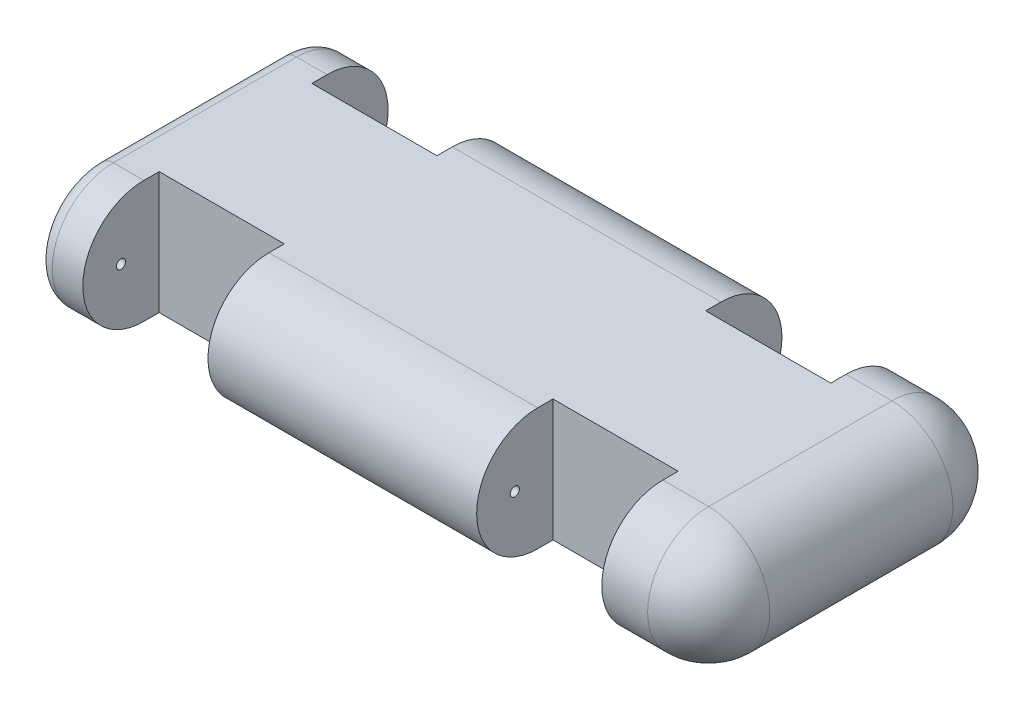
ISO-10303-21;
HEADER;
FILE_DESCRIPTION(('STEP AP214'),'2;1');
FILE_NAME('part.step','',(''),(''),'','','');
FILE_SCHEMA(('AUTOMOTIVE_DESIGN { 1 0 10303 214 1 1 1 1 }'));
ENDSEC;
DATA;
#1=APPLICATION_CONTEXT('core data for automotive mechanical design processes');
#2=APPLICATION_PROTOCOL_DEFINITION('international standard','automotive_design',2000,#1);
#3=PRODUCT_CONTEXT('',#1,'mechanical');
#4=PRODUCT('Part','Part','',(#3));
#5=PRODUCT_RELATED_PRODUCT_CATEGORY('part','',(#4));
#6=PRODUCT_DEFINITION_FORMATION('','',#4);
#7=PRODUCT_DEFINITION_CONTEXT('part definition',#1,'design');
#8=PRODUCT_DEFINITION('design','',#6,#7);
#9=PRODUCT_DEFINITION_SHAPE('','',#8);
#10=(LENGTH_UNIT() NAMED_UNIT(*) SI_UNIT(.MILLI.,.METRE.));
#11=(NAMED_UNIT(*) PLANE_ANGLE_UNIT() SI_UNIT($,.RADIAN.));
#12=(NAMED_UNIT(*) SI_UNIT($,.STERADIAN.) SOLID_ANGLE_UNIT());
#13=UNCERTAINTY_MEASURE_WITH_UNIT(LENGTH_MEASURE(1.E-05),#10,'distance_accuracy_value','');
#14=(GEOMETRIC_REPRESENTATION_CONTEXT(3) GLOBAL_UNCERTAINTY_ASSIGNED_CONTEXT((#13)) GLOBAL_UNIT_ASSIGNED_CONTEXT((#10,
#11,#12)) REPRESENTATION_CONTEXT('',''));
#15=CARTESIAN_POINT('',(0.,0.,0.));
#16=DIRECTION('',(0.,0.,1.));
#17=DIRECTION('',(1.,0.,0.));
#18=AXIS2_PLACEMENT_3D('',#15,#16,#17);
#19=CARTESIAN_POINT('',(-200.,40.,-100.));
#20=DIRECTION('',(1.,0.,0.));
#21=DIRECTION('',(0.,0.,-1.));
#22=AXIS2_PLACEMENT_3D('',#19,#20,#21);
#23=PLANE('',#22);
#24=DIRECTION('',(0.,0.,1.));
#25=VECTOR('',#24,1.);
#26=CARTESIAN_POINT('',(-200.,30.,-60.));
#27=LINE('',#26,#25);
#28=CARTESIAN_POINT('',(-200.,30.,60.));
#29=VERTEX_POINT('',#28);
#30=CARTESIAN_POINT('',(-200.,30.,-60.));
#31=VERTEX_POINT('',#30);
#32=EDGE_CURVE('E279',#29,#31,#27,.F.);
#33=ORIENTED_EDGE('',*,*,#32,.T.);
#34=CARTESIAN_POINT('',(-200.,0.,-60.));
#35=DIRECTION('',(1.,0.,0.));
#36=DIRECTION('',(0.,0.,-1.));
#37=AXIS2_PLACEMENT_3D('',#34,#35,#36);
#38=CIRCLE('',#37,30.);
#39=CARTESIAN_POINT('',(-200.,-30.,-60.));
#40=VERTEX_POINT('',#39);
#41=EDGE_CURVE('E285',#31,#40,#38,.F.);
#42=ORIENTED_EDGE('',*,*,#41,.T.);
#43=DIRECTION('',(0.,0.,1.));
#44=VECTOR('',#43,1.);
#45=CARTESIAN_POINT('',(-200.,-30.,-100.));
#46=LINE('',#45,#44);
#47=CARTESIAN_POINT('',(-200.,-30.,60.));
#48=VERTEX_POINT('',#47);
#49=EDGE_CURVE('E283',#40,#48,#46,.T.);
#50=ORIENTED_EDGE('',*,*,#49,.T.);
#51=CARTESIAN_POINT('',(-200.,0.,60.));
#52=DIRECTION('',(1.,0.,0.));
#53=DIRECTION('',(0.,0.,-1.));
#54=AXIS2_PLACEMENT_3D('',#51,#52,#53);
#55=CIRCLE('',#54,30.);
#56=EDGE_CURVE('E281',#48,#29,#55,.F.);
#57=ORIENTED_EDGE('',*,*,#56,.T.);
#58=EDGE_LOOP('',(#33,#42,#50,#57));
#59=FACE_BOUND('',#58,.T.);
#60=CARTESIAN_POINT('',(-200.,0.,74.9999999999999));
#61=DIRECTION('',(-1.,0.,0.));
#62=DIRECTION('',(0.,0.,1.));
#63=AXIS2_PLACEMENT_3D('',#60,#61,#62);
#64=CIRCLE('',#63,3.00000000000001);
#65=CARTESIAN_POINT('',(-200.,0.,77.9999999999999));
#66=VERTEX_POINT('',#65);
#67=EDGE_CURVE('E339',#66,#66,#64,.T.);
#68=ORIENTED_EDGE('',*,*,#67,.F.);
#69=EDGE_LOOP('',(#68));
#70=FACE_BOUND('',#69,.T.);
#71=CARTESIAN_POINT('',(-200.,0.,-74.9999999999999));
#72=DIRECTION('',(-1.,0.,0.));
#73=DIRECTION('',(0.,0.,1.));
#74=AXIS2_PLACEMENT_3D('',#71,#72,#73);
#75=CIRCLE('',#74,3.00000000000001);
#76=CARTESIAN_POINT('',(-200.,0.,-71.9999999999999));
#77=VERTEX_POINT('',#76);
#78=EDGE_CURVE('E357',#77,#77,#75,.T.);
#79=ORIENTED_EDGE('',*,*,#78,.F.);
#80=EDGE_LOOP('',(#79));
#81=FACE_BOUND('',#80,.T.);
#82=ADVANCED_FACE('F37',(#59,#70,#81),#23,.F.);
#83=CARTESIAN_POINT('',(-170.,40.,100.));
#84=DIRECTION('',(-1.,0.,0.));
#85=DIRECTION('',(0.,0.,1.));
#86=AXIS2_PLACEMENT_3D('',#83,#84,#85);
#87=PLANE('',#86);
#88=CARTESIAN_POINT('',(-170.,0.,74.9999999999998));
#89=DIRECTION('',(-1.,0.,0.));
#90=DIRECTION('',(0.,0.,1.));
#91=AXIS2_PLACEMENT_3D('',#88,#89,#90);
#92=CIRCLE('',#91,3.00000000000001);
#93=CARTESIAN_POINT('',(-170.,0.,77.9999999999998));
#94=VERTEX_POINT('',#93);
#95=EDGE_CURVE('E354',#94,#94,#92,.T.);
#96=ORIENTED_EDGE('',*,*,#95,.T.);
#97=EDGE_LOOP('',(#96));
#98=FACE_BOUND('',#97,.T.);
#99=DIRECTION('',(0.,0.,-1.));
#100=VECTOR('',#99,1.);
#101=CARTESIAN_POINT('',(-170.,40.,100.));
#102=LINE('',#101,#100);
#103=CARTESIAN_POINT('',(-170.,40.,60.));
#104=VERTEX_POINT('',#103);
#105=CARTESIAN_POINT('',(-170.,40.,50.));
#106=VERTEX_POINT('',#105);
#107=EDGE_CURVE('E239',#104,#106,#102,.T.);
#108=ORIENTED_EDGE('',*,*,#107,.F.);
#109=CARTESIAN_POINT('',(-170.,0.,60.));
#110=DIRECTION('',(-1.,0.,0.));
#111=DIRECTION('',(0.,0.,1.));
#112=AXIS2_PLACEMENT_3D('',#109,#110,#111);
#113=CIRCLE('',#112,40.);
#114=CARTESIAN_POINT('',(-170.,-40.,60.));
#115=VERTEX_POINT('',#114);
#116=EDGE_CURVE('E214',#104,#115,#113,.F.);
#117=ORIENTED_EDGE('',*,*,#116,.T.);
#118=DIRECTION('',(0.,0.,-1.));
#119=VECTOR('',#118,1.);
#120=CARTESIAN_POINT('',(-170.,-40.,100.));
#121=LINE('',#120,#119);
#122=CARTESIAN_POINT('',(-170.,-40.,50.));
#123=VERTEX_POINT('',#122);
#124=EDGE_CURVE('E370',#115,#123,#121,.T.);
#125=ORIENTED_EDGE('',*,*,#124,.T.);
#126=DIRECTION('',(0.,-1.,0.));
#127=VECTOR('',#126,1.);
#128=CARTESIAN_POINT('',(-170.,40.,50.));
#129=LINE('',#128,#127);
#130=EDGE_CURVE('E262',#106,#123,#129,.T.);
#131=ORIENTED_EDGE('',*,*,#130,.F.);
#132=EDGE_LOOP('',(#108,#117,#125,#131));
#133=FACE_BOUND('',#132,.T.);
#134=ADVANCED_FACE('F438',(#98,#133),#87,.F.);
#135=CARTESIAN_POINT('',(-88.,40.,100.));
#136=DIRECTION('',(1.,0.,0.));
#137=DIRECTION('',(0.,0.,-1.));
#138=AXIS2_PLACEMENT_3D('',#135,#136,#137);
#139=PLANE('',#138);
#140=CARTESIAN_POINT('',(-88.0000000000001,0.,74.9999999999997));
#141=DIRECTION('',(1.,0.,0.));
#142=DIRECTION('',(0.,0.,-1.));
#143=AXIS2_PLACEMENT_3D('',#140,#141,#142);
#144=CIRCLE('',#143,3.00000000000001);
#145=CARTESIAN_POINT('',(-88.0000000000001,0.,71.9999999999997));
#146=VERTEX_POINT('',#145);
#147=EDGE_CURVE('E351',#146,#146,#144,.T.);
#148=ORIENTED_EDGE('',*,*,#147,.T.);
#149=EDGE_LOOP('',(#148));
#150=FACE_BOUND('',#149,.T.);
#151=DIRECTION('',(0.,0.,1.));
#152=VECTOR('',#151,1.);
#153=CARTESIAN_POINT('',(-88.,-40.,100.));
#154=LINE('',#153,#152);
#155=CARTESIAN_POINT('',(-88.,-40.,50.));
#156=VERTEX_POINT('',#155);
#157=CARTESIAN_POINT('',(-88.,-40.,60.));
#158=VERTEX_POINT('',#157);
#159=EDGE_CURVE('E401',#156,#158,#154,.T.);
#160=ORIENTED_EDGE('',*,*,#159,.T.);
#161=CARTESIAN_POINT('',(-88.0000000000001,0.,60.));
#162=DIRECTION('',(1.,0.,0.));
#163=DIRECTION('',(0.,0.,-1.));
#164=AXIS2_PLACEMENT_3D('',#161,#162,#163);
#165=CIRCLE('',#164,40.);
#166=CARTESIAN_POINT('',(-88.0000000000001,40.,60.));
#167=VERTEX_POINT('',#166);
#168=EDGE_CURVE('E432',#158,#167,#165,.F.);
#169=ORIENTED_EDGE('',*,*,#168,.T.);
#170=DIRECTION('',(0.,0.,1.));
#171=VECTOR('',#170,1.);
#172=CARTESIAN_POINT('',(-88.,40.,100.));
#173=LINE('',#172,#171);
#174=CARTESIAN_POINT('',(-88.,40.,50.));
#175=VERTEX_POINT('',#174);
#176=EDGE_CURVE('E374',#175,#167,#173,.T.);
#177=ORIENTED_EDGE('',*,*,#176,.F.);
#178=DIRECTION('',(0.,-1.,0.));
#179=VECTOR('',#178,1.);
#180=CARTESIAN_POINT('',(-88.,40.,50.));
#181=LINE('',#180,#179);
#182=EDGE_CURVE('E259',#175,#156,#181,.T.);
#183=ORIENTED_EDGE('',*,*,#182,.T.);
#184=EDGE_LOOP('',(#160,#169,#177,#183));
#185=FACE_BOUND('',#184,.T.);
#186=ADVANCED_FACE('F449',(#150,#185),#139,.F.);
#187=CARTESIAN_POINT('',(88.,40.,100.));
#188=DIRECTION('',(-1.,0.,0.));
#189=DIRECTION('',(0.,0.,1.));
#190=AXIS2_PLACEMENT_3D('',#187,#188,#189);
#191=PLANE('',#190);
#192=CARTESIAN_POINT('',(88.,0.,74.9999999999995));
#193=DIRECTION('',(-1.,0.,0.));
#194=DIRECTION('',(0.,0.,1.));
#195=AXIS2_PLACEMENT_3D('',#192,#193,#194);
#196=CIRCLE('',#195,3.00000000000001);
#197=CARTESIAN_POINT('',(88.,0.,77.9999999999995));
#198=VERTEX_POINT('',#197);
#199=EDGE_CURVE('E348',#198,#198,#196,.T.);
#200=ORIENTED_EDGE('',*,*,#199,.T.);
#201=EDGE_LOOP('',(#200));
#202=FACE_BOUND('',#201,.T.);
#203=DIRECTION('',(0.,0.,-1.));
#204=VECTOR('',#203,1.);
#205=CARTESIAN_POINT('',(88.,40.,100.));
#206=LINE('',#205,#204);
#207=CARTESIAN_POINT('',(88.,40.,60.));
#208=VERTEX_POINT('',#207);
#209=CARTESIAN_POINT('',(88.,40.,50.));
#210=VERTEX_POINT('',#209);
#211=EDGE_CURVE('E377',#208,#210,#206,.T.);
#212=ORIENTED_EDGE('',*,*,#211,.F.);
#213=CARTESIAN_POINT('',(88.,0.,60.));
#214=DIRECTION('',(-1.,0.,0.));
#215=DIRECTION('',(0.,0.,1.));
#216=AXIS2_PLACEMENT_3D('',#213,#214,#215);
#217=CIRCLE('',#216,40.);
#218=CARTESIAN_POINT('',(88.,-40.,60.));
#219=VERTEX_POINT('',#218);
#220=EDGE_CURVE('E429',#208,#219,#217,.F.);
#221=ORIENTED_EDGE('',*,*,#220,.T.);
#222=DIRECTION('',(0.,0.,-1.));
#223=VECTOR('',#222,1.);
#224=CARTESIAN_POINT('',(88.,-40.,100.));
#225=LINE('',#224,#223);
#226=CARTESIAN_POINT('',(88.,-40.,50.));
#227=VERTEX_POINT('',#226);
#228=EDGE_CURVE('E404',#219,#227,#225,.T.);
#229=ORIENTED_EDGE('',*,*,#228,.T.);
#230=DIRECTION('',(0.,-1.,0.));
#231=VECTOR('',#230,1.);
#232=CARTESIAN_POINT('',(88.,40.,50.));
#233=LINE('',#232,#231);
#234=EDGE_CURVE('E256',#210,#227,#233,.T.);
#235=ORIENTED_EDGE('',*,*,#234,.F.);
#236=EDGE_LOOP('',(#212,#221,#229,#235));
#237=FACE_BOUND('',#236,.T.);
#238=ADVANCED_FACE('F608',(#202,#237),#191,.F.);
#239=CARTESIAN_POINT('',(170.,40.,100.));
#240=DIRECTION('',(1.,0.,0.));
#241=DIRECTION('',(0.,0.,-1.));
#242=AXIS2_PLACEMENT_3D('',#239,#240,#241);
#243=PLANE('',#242);
#244=CARTESIAN_POINT('',(170.,0.,74.9999999999993));
#245=DIRECTION('',(1.,0.,0.));
#246=DIRECTION('',(0.,0.,-1.));
#247=AXIS2_PLACEMENT_3D('',#244,#245,#246);
#248=CIRCLE('',#247,3.00000000000001);
#249=CARTESIAN_POINT('',(170.,0.,71.9999999999993));
#250=VERTEX_POINT('',#249);
#251=EDGE_CURVE('E345',#250,#250,#248,.T.);
#252=ORIENTED_EDGE('',*,*,#251,.T.);
#253=EDGE_LOOP('',(#252));
#254=FACE_BOUND('',#253,.T.);
#255=DIRECTION('',(0.,0.,1.));
#256=VECTOR('',#255,1.);
#257=CARTESIAN_POINT('',(170.,-40.,100.));
#258=LINE('',#257,#256);
#259=CARTESIAN_POINT('',(170.,-40.,50.));
#260=VERTEX_POINT('',#259);
#261=CARTESIAN_POINT('',(170.,-40.,60.));
#262=VERTEX_POINT('',#261);
#263=EDGE_CURVE('E219',#260,#262,#258,.T.);
#264=ORIENTED_EDGE('',*,*,#263,.T.);
#265=CARTESIAN_POINT('',(170.,0.,60.));
#266=DIRECTION('',(1.,0.,0.));
#267=DIRECTION('',(0.,0.,-1.));
#268=AXIS2_PLACEMENT_3D('',#265,#266,#267);
#269=CIRCLE('',#268,40.);
#270=CARTESIAN_POINT('',(170.,40.,60.));
#271=VERTEX_POINT('',#270);
#272=EDGE_CURVE('E427',#262,#271,#269,.F.);
#273=ORIENTED_EDGE('',*,*,#272,.T.);
#274=DIRECTION('',(0.,0.,1.));
#275=VECTOR('',#274,1.);
#276=CARTESIAN_POINT('',(170.,40.,100.));
#277=LINE('',#276,#275);
#278=CARTESIAN_POINT('',(170.,40.,50.));
#279=VERTEX_POINT('',#278);
#280=EDGE_CURVE('E381',#279,#271,#277,.T.);
#281=ORIENTED_EDGE('',*,*,#280,.F.);
#282=DIRECTION('',(0.,-1.,0.));
#283=VECTOR('',#282,1.);
#284=CARTESIAN_POINT('',(170.,40.,50.));
#285=LINE('',#284,#283);
#286=EDGE_CURVE('E253',#279,#260,#285,.T.);
#287=ORIENTED_EDGE('',*,*,#286,.T.);
#288=EDGE_LOOP('',(#264,#273,#281,#287));
#289=FACE_BOUND('',#288,.T.);
#290=ADVANCED_FACE('F415',(#254,#289),#243,.F.);
#291=CARTESIAN_POINT('',(170.,40.,-100.));
#292=DIRECTION('',(1.,0.,0.));
#293=DIRECTION('',(0.,0.,-1.));
#294=AXIS2_PLACEMENT_3D('',#291,#292,#293);
#295=PLANE('',#294);
#296=CARTESIAN_POINT('',(170.,0.,-74.9999999999994));
#297=DIRECTION('',(1.,0.,0.));
#298=DIRECTION('',(0.,0.,-1.));
#299=AXIS2_PLACEMENT_3D('',#296,#297,#298);
#300=CIRCLE('',#299,3.00000000000001);
#301=CARTESIAN_POINT('',(170.,0.,-77.9999999999994));
#302=VERTEX_POINT('',#301);
#303=EDGE_CURVE('E367',#302,#302,#300,.T.);
#304=ORIENTED_EDGE('',*,*,#303,.T.);
#305=EDGE_LOOP('',(#304));
#306=FACE_BOUND('',#305,.T.);
#307=CARTESIAN_POINT('',(170.,0.,-60.));
#308=DIRECTION('',(1.,0.,0.));
#309=DIRECTION('',(0.,0.,-1.));
#310=AXIS2_PLACEMENT_3D('',#307,#308,#309);
#311=CIRCLE('',#310,40.);
#312=CARTESIAN_POINT('',(170.,40.,-60.));
#313=VERTEX_POINT('',#312);
#314=CARTESIAN_POINT('',(170.,-40.,-60.));
#315=VERTEX_POINT('',#314);
#316=EDGE_CURVE('E337',#313,#315,#311,.F.);
#317=ORIENTED_EDGE('',*,*,#316,.T.);
#318=DIRECTION('',(0.,0.,1.));
#319=VECTOR('',#318,1.);
#320=CARTESIAN_POINT('',(170.,-40.,-100.));
#321=LINE('',#320,#319);
#322=CARTESIAN_POINT('',(170.,-40.,-50.));
#323=VERTEX_POINT('',#322);
#324=EDGE_CURVE('E206',#315,#323,#321,.T.);
#325=ORIENTED_EDGE('',*,*,#324,.T.);
#326=DIRECTION('',(0.,-1.,0.));
#327=VECTOR('',#326,1.);
#328=CARTESIAN_POINT('',(170.,40.,-50.));
#329=LINE('',#328,#327);
#330=CARTESIAN_POINT('',(170.,40.,-50.));
#331=VERTEX_POINT('',#330);
#332=EDGE_CURVE('E250',#331,#323,#329,.T.);
#333=ORIENTED_EDGE('',*,*,#332,.F.);
#334=DIRECTION('',(0.,0.,1.));
#335=VECTOR('',#334,1.);
#336=CARTESIAN_POINT('',(170.,40.,-100.));
#337=LINE('',#336,#335);
#338=EDGE_CURVE('E386',#313,#331,#337,.T.);
#339=ORIENTED_EDGE('',*,*,#338,.F.);
#340=EDGE_LOOP('',(#317,#325,#333,#339));
#341=FACE_BOUND('',#340,.T.);
#342=ADVANCED_FACE('F607',(#306,#341),#295,.F.);
#343=CARTESIAN_POINT('',(88.,40.,-100.));
#344=DIRECTION('',(-1.,0.,0.));
#345=DIRECTION('',(0.,0.,1.));
#346=AXIS2_PLACEMENT_3D('',#343,#344,#345);
#347=PLANE('',#346);
#348=CARTESIAN_POINT('',(88.,0.,-74.9999999999995));
#349=DIRECTION('',(-1.,0.,0.));
#350=DIRECTION('',(0.,0.,1.));
#351=AXIS2_PLACEMENT_3D('',#348,#349,#350);
#352=CIRCLE('',#351,3.00000000000001);
#353=CARTESIAN_POINT('',(88.,0.,-71.9999999999995));
#354=VERTEX_POINT('',#353);
#355=EDGE_CURVE('E364',#354,#354,#352,.T.);
#356=ORIENTED_EDGE('',*,*,#355,.T.);
#357=EDGE_LOOP('',(#356));
#358=FACE_BOUND('',#357,.T.);
#359=DIRECTION('',(0.,0.,-1.));
#360=VECTOR('',#359,1.);
#361=CARTESIAN_POINT('',(88.,-40.,-100.));
#362=LINE('',#361,#360);
#363=CARTESIAN_POINT('',(88.,-40.,-50.));
#364=VERTEX_POINT('',#363);
#365=CARTESIAN_POINT('',(88.,-40.,-60.));
#366=VERTEX_POINT('',#365);
#367=EDGE_CURVE('E229',#364,#366,#362,.T.);
#368=ORIENTED_EDGE('',*,*,#367,.T.);
#369=CARTESIAN_POINT('',(88.,0.,-60.));
#370=DIRECTION('',(-1.,0.,0.));
#371=DIRECTION('',(0.,0.,1.));
#372=AXIS2_PLACEMENT_3D('',#369,#370,#371);
#373=CIRCLE('',#372,40.);
#374=CARTESIAN_POINT('',(88.,40.,-60.));
#375=VERTEX_POINT('',#374);
#376=EDGE_CURVE('E333',#366,#375,#373,.F.);
#377=ORIENTED_EDGE('',*,*,#376,.T.);
#378=DIRECTION('',(0.,0.,-1.));
#379=VECTOR('',#378,1.);
#380=CARTESIAN_POINT('',(88.,40.,-100.));
#381=LINE('',#380,#379);
#382=CARTESIAN_POINT('',(88.,40.,-50.));
#383=VERTEX_POINT('',#382);
#384=EDGE_CURVE('E390',#383,#375,#381,.T.);
#385=ORIENTED_EDGE('',*,*,#384,.F.);
#386=DIRECTION('',(0.,-1.,0.));
#387=VECTOR('',#386,1.);
#388=CARTESIAN_POINT('',(88.,40.,-50.));
#389=LINE('',#388,#387);
#390=EDGE_CURVE('E247',#383,#364,#389,.T.);
#391=ORIENTED_EDGE('',*,*,#390,.T.);
#392=EDGE_LOOP('',(#368,#377,#385,#391));
#393=FACE_BOUND('',#392,.T.);
#394=ADVANCED_FACE('F663',(#358,#393),#347,.F.);
#395=CARTESIAN_POINT('',(-88.,40.,-100.));
#396=DIRECTION('',(1.,0.,0.));
#397=DIRECTION('',(0.,0.,-1.));
#398=AXIS2_PLACEMENT_3D('',#395,#396,#397);
#399=PLANE('',#398);
#400=CARTESIAN_POINT('',(-88.0000000000001,0.,-74.9999999999998));
#401=DIRECTION('',(1.,0.,0.));
#402=DIRECTION('',(0.,0.,-1.));
#403=AXIS2_PLACEMENT_3D('',#400,#401,#402);
#404=CIRCLE('',#403,3.00000000000001);
#405=CARTESIAN_POINT('',(-88.0000000000001,0.,-77.9999999999998));
#406=VERTEX_POINT('',#405);
#407=EDGE_CURVE('E269',#406,#406,#404,.T.);
#408=ORIENTED_EDGE('',*,*,#407,.T.);
#409=EDGE_LOOP('',(#408));
#410=FACE_BOUND('',#409,.T.);
#411=DIRECTION('',(0.,0.,1.));
#412=VECTOR('',#411,1.);
#413=CARTESIAN_POINT('',(-88.,40.,-100.));
#414=LINE('',#413,#412);
#415=CARTESIAN_POINT('',(-88.0000000000001,40.,-60.));
#416=VERTEX_POINT('',#415);
#417=CARTESIAN_POINT('',(-88.,40.,-50.));
#418=VERTEX_POINT('',#417);
#419=EDGE_CURVE('E393',#416,#418,#414,.T.);
#420=ORIENTED_EDGE('',*,*,#419,.F.);
#421=CARTESIAN_POINT('',(-88.0000000000001,0.,-60.));
#422=DIRECTION('',(1.,0.,0.));
#423=DIRECTION('',(0.,0.,-1.));
#424=AXIS2_PLACEMENT_3D('',#421,#422,#423);
#425=CIRCLE('',#424,40.);
#426=CARTESIAN_POINT('',(-88.0000000000001,-40.,-60.));
#427=VERTEX_POINT('',#426);
#428=EDGE_CURVE('E329',#416,#427,#425,.F.);
#429=ORIENTED_EDGE('',*,*,#428,.T.);
#430=DIRECTION('',(0.,0.,1.));
#431=VECTOR('',#430,1.);
#432=CARTESIAN_POINT('',(-88.,-40.,-100.));
#433=LINE('',#432,#431);
#434=CARTESIAN_POINT('',(-88.,-40.,-50.));
#435=VERTEX_POINT('',#434);
#436=EDGE_CURVE('E232',#427,#435,#433,.T.);
#437=ORIENTED_EDGE('',*,*,#436,.T.);
#438=DIRECTION('',(0.,-1.,0.));
#439=VECTOR('',#438,1.);
#440=CARTESIAN_POINT('',(-88.,40.,-50.));
#441=LINE('',#440,#439);
#442=EDGE_CURVE('E243',#418,#435,#441,.T.);
#443=ORIENTED_EDGE('',*,*,#442,.F.);
#444=EDGE_LOOP('',(#420,#429,#437,#443));
#445=FACE_BOUND('',#444,.T.);
#446=ADVANCED_FACE('F651',(#410,#445),#399,.F.);
#447=CARTESIAN_POINT('',(-170.,40.,-100.));
#448=DIRECTION('',(-1.,0.,0.));
#449=DIRECTION('',(0.,0.,1.));
#450=AXIS2_PLACEMENT_3D('',#447,#448,#449);
#451=PLANE('',#450);
#452=CARTESIAN_POINT('',(-170.,0.,-74.9999999999999));
#453=DIRECTION('',(-1.,0.,0.));
#454=DIRECTION('',(0.,0.,1.));
#455=AXIS2_PLACEMENT_3D('',#452,#453,#454);
#456=CIRCLE('',#455,3.00000000000001);
#457=CARTESIAN_POINT('',(-170.,0.,-71.9999999999999));
#458=VERTEX_POINT('',#457);
#459=EDGE_CURVE('E266',#458,#458,#456,.T.);
#460=ORIENTED_EDGE('',*,*,#459,.T.);
#461=EDGE_LOOP('',(#460));
#462=FACE_BOUND('',#461,.T.);
#463=DIRECTION('',(0.,0.,-1.));
#464=VECTOR('',#463,1.);
#465=CARTESIAN_POINT('',(-170.,-40.,-100.));
#466=LINE('',#465,#464);
#467=CARTESIAN_POINT('',(-170.,-40.,-50.));
#468=VERTEX_POINT('',#467);
#469=CARTESIAN_POINT('',(-170.,-40.,-60.));
#470=VERTEX_POINT('',#469);
#471=EDGE_CURVE('E236',#468,#470,#466,.T.);
#472=ORIENTED_EDGE('',*,*,#471,.T.);
#473=CARTESIAN_POINT('',(-170.,0.,-60.));
#474=DIRECTION('',(-1.,0.,0.));
#475=DIRECTION('',(0.,0.,1.));
#476=AXIS2_PLACEMENT_3D('',#473,#474,#475);
#477=CIRCLE('',#476,40.);
#478=CARTESIAN_POINT('',(-170.,40.,-60.));
#479=VERTEX_POINT('',#478);
#480=EDGE_CURVE('E327',#470,#479,#477,.F.);
#481=ORIENTED_EDGE('',*,*,#480,.T.);
#482=DIRECTION('',(0.,0.,-1.));
#483=VECTOR('',#482,1.);
#484=CARTESIAN_POINT('',(-170.,40.,-100.));
#485=LINE('',#484,#483);
#486=CARTESIAN_POINT('',(-170.,40.,-50.));
#487=VERTEX_POINT('',#486);
#488=EDGE_CURVE('E244',#487,#479,#485,.T.);
#489=ORIENTED_EDGE('',*,*,#488,.F.);
#490=DIRECTION('',(0.,-1.,0.));
#491=VECTOR('',#490,1.);
#492=CARTESIAN_POINT('',(-170.,40.,-50.));
#493=LINE('',#492,#491);
#494=EDGE_CURVE('E240',#487,#468,#493,.T.);
#495=ORIENTED_EDGE('',*,*,#494,.T.);
#496=EDGE_LOOP('',(#472,#481,#489,#495));
#497=FACE_BOUND('',#496,.T.);
#498=ADVANCED_FACE('F646',(#462,#497),#451,.F.);
#499=CARTESIAN_POINT('',(-170.,40.,50.));
#500=DIRECTION('',(0.,0.,-1.));
#501=DIRECTION('',(-1.,0.,0.));
#502=AXIS2_PLACEMENT_3D('',#499,#500,#501);
#503=PLANE('',#502);
#504=DIRECTION('',(1.,0.,0.));
#505=VECTOR('',#504,1.);
#506=CARTESIAN_POINT('',(-170.,-40.,50.));
#507=LINE('',#506,#505);
#508=EDGE_CURVE('E399',#123,#156,#507,.T.);
#509=ORIENTED_EDGE('',*,*,#508,.T.);
#510=ORIENTED_EDGE('',*,*,#182,.F.);
#511=DIRECTION('',(1.,0.,0.));
#512=VECTOR('',#511,1.);
#513=CARTESIAN_POINT('',(-170.,40.,50.));
#514=LINE('',#513,#512);
#515=EDGE_CURVE('E372',#106,#175,#514,.T.);
#516=ORIENTED_EDGE('',*,*,#515,.F.);
#517=ORIENTED_EDGE('',*,*,#130,.T.);
#518=EDGE_LOOP('',(#509,#510,#516,#517));
#519=FACE_BOUND('',#518,.T.);
#520=ADVANCED_FACE('F445',(#519),#503,.F.);
#521=CARTESIAN_POINT('',(88.,40.,50.));
#522=DIRECTION('',(0.,0.,-1.));
#523=DIRECTION('',(-1.,0.,0.));
#524=AXIS2_PLACEMENT_3D('',#521,#522,#523);
#525=PLANE('',#524);
#526=DIRECTION('',(1.,0.,0.));
#527=VECTOR('',#526,1.);
#528=CARTESIAN_POINT('',(88.,-40.,50.));
#529=LINE('',#528,#527);
#530=EDGE_CURVE('E224',#227,#260,#529,.T.);
#531=ORIENTED_EDGE('',*,*,#530,.T.);
#532=ORIENTED_EDGE('',*,*,#286,.F.);
#533=DIRECTION('',(1.,0.,0.));
#534=VECTOR('',#533,1.);
#535=CARTESIAN_POINT('',(88.,40.,50.));
#536=LINE('',#535,#534);
#537=EDGE_CURVE('E379',#210,#279,#536,.T.);
#538=ORIENTED_EDGE('',*,*,#537,.F.);
#539=ORIENTED_EDGE('',*,*,#234,.T.);
#540=EDGE_LOOP('',(#531,#532,#538,#539));
#541=FACE_BOUND('',#540,.T.);
#542=ADVANCED_FACE('F408',(#541),#525,.F.);
#543=CARTESIAN_POINT('',(88.,40.,-50.));
#544=DIRECTION('',(0.,0.,1.));
#545=DIRECTION('',(1.,0.,0.));
#546=AXIS2_PLACEMENT_3D('',#543,#544,#545);
#547=PLANE('',#546);
#548=DIRECTION('',(-1.,0.,0.));
#549=VECTOR('',#548,1.);
#550=CARTESIAN_POINT('',(88.,-40.,-50.));
#551=LINE('',#550,#549);
#552=EDGE_CURVE('E221',#323,#364,#551,.T.);
#553=ORIENTED_EDGE('',*,*,#552,.T.);
#554=ORIENTED_EDGE('',*,*,#390,.F.);
#555=DIRECTION('',(-1.,0.,0.));
#556=VECTOR('',#555,1.);
#557=CARTESIAN_POINT('',(88.,40.,-50.));
#558=LINE('',#557,#556);
#559=EDGE_CURVE('E388',#331,#383,#558,.T.);
#560=ORIENTED_EDGE('',*,*,#559,.F.);
#561=ORIENTED_EDGE('',*,*,#332,.T.);
#562=EDGE_LOOP('',(#553,#554,#560,#561));
#563=FACE_BOUND('',#562,.T.);
#564=ADVANCED_FACE('F740',(#563),#547,.F.);
#565=CARTESIAN_POINT('',(-170.,40.,-50.));
#566=DIRECTION('',(0.,0.,1.));
#567=DIRECTION('',(1.,0.,0.));
#568=AXIS2_PLACEMENT_3D('',#565,#566,#567);
#569=PLANE('',#568);
#570=DIRECTION('',(-1.,0.,0.));
#571=VECTOR('',#570,1.);
#572=CARTESIAN_POINT('',(-170.,-40.,-50.));
#573=LINE('',#572,#571);
#574=EDGE_CURVE('E234',#435,#468,#573,.T.);
#575=ORIENTED_EDGE('',*,*,#574,.T.);
#576=ORIENTED_EDGE('',*,*,#494,.F.);
#577=DIRECTION('',(-1.,0.,0.));
#578=VECTOR('',#577,1.);
#579=CARTESIAN_POINT('',(-170.,40.,-50.));
#580=LINE('',#579,#578);
#581=EDGE_CURVE('E395',#418,#487,#580,.T.);
#582=ORIENTED_EDGE('',*,*,#581,.F.);
#583=ORIENTED_EDGE('',*,*,#442,.T.);
#584=EDGE_LOOP('',(#575,#576,#582,#583));
#585=FACE_BOUND('',#584,.T.);
#586=ADVANCED_FACE('F539',(#585),#569,.F.);
#587=CARTESIAN_POINT('',(0.,40.,0.));
#588=DIRECTION('',(0.,1.,0.));
#589=DIRECTION('',(0.,0.,1.));
#590=AXIS2_PLACEMENT_3D('',#587,#588,#589);
#591=PLANE('',#590);
#592=DIRECTION('',(-1.,0.,0.));
#593=VECTOR('',#592,1.);
#594=CARTESIAN_POINT('',(200.,40.,-60.));
#595=LINE('',#594,#593);
#596=CARTESIAN_POINT('',(-190.,40.,-60.));
#597=VERTEX_POINT('',#596);
#598=EDGE_CURVE('E208',#479,#597,#595,.T.);
#599=ORIENTED_EDGE('',*,*,#598,.T.);
#600=DIRECTION('',(0.,0.,1.));
#601=VECTOR('',#600,1.);
#602=CARTESIAN_POINT('',(-190.,40.,60.));
#603=LINE('',#602,#601);
#604=CARTESIAN_POINT('',(-190.,40.,60.));
#605=VERTEX_POINT('',#604);
#606=EDGE_CURVE('E11',#597,#605,#603,.T.);
#607=ORIENTED_EDGE('',*,*,#606,.T.);
#608=DIRECTION('',(-1.,0.,0.));
#609=VECTOR('',#608,1.);
#610=CARTESIAN_POINT('',(200.,40.,60.));
#611=LINE('',#610,#609);
#612=EDGE_CURVE('E419',#104,#605,#611,.T.);
#613=ORIENTED_EDGE('',*,*,#612,.F.);
#614=ORIENTED_EDGE('',*,*,#107,.T.);
#615=ORIENTED_EDGE('',*,*,#515,.T.);
#616=ORIENTED_EDGE('',*,*,#176,.T.);
#617=EDGE_CURVE('E422',#208,#167,#611,.T.);
#618=ORIENTED_EDGE('',*,*,#617,.F.);
#619=ORIENTED_EDGE('',*,*,#211,.T.);
#620=ORIENTED_EDGE('',*,*,#537,.T.);
#621=ORIENTED_EDGE('',*,*,#280,.T.);
#622=CARTESIAN_POINT('',(200.000000000001,40.,60.));
#623=VERTEX_POINT('',#622);
#624=EDGE_CURVE('E424',#623,#271,#611,.T.);
#625=ORIENTED_EDGE('',*,*,#624,.F.);
#626=DIRECTION('',(0.,0.,-1.));
#627=VECTOR('',#626,1.);
#628=CARTESIAN_POINT('',(200.,40.,-100.));
#629=LINE('',#628,#627);
#630=CARTESIAN_POINT('',(200.,40.,-60.));
#631=VERTEX_POINT('',#630);
#632=EDGE_CURVE('E384',#623,#631,#629,.T.);
#633=ORIENTED_EDGE('',*,*,#632,.T.);
#634=EDGE_CURVE('E213',#631,#313,#595,.T.);
#635=ORIENTED_EDGE('',*,*,#634,.T.);
#636=ORIENTED_EDGE('',*,*,#338,.T.);
#637=ORIENTED_EDGE('',*,*,#559,.T.);
#638=ORIENTED_EDGE('',*,*,#384,.T.);
#639=EDGE_CURVE('E324',#375,#416,#595,.T.);
#640=ORIENTED_EDGE('',*,*,#639,.T.);
#641=ORIENTED_EDGE('',*,*,#419,.T.);
#642=ORIENTED_EDGE('',*,*,#581,.T.);
#643=ORIENTED_EDGE('',*,*,#488,.T.);
#644=EDGE_LOOP('',(#599,#607,#613,#614,#615,#616,#618,#619,#620,#621,#625,#633,#635,#636,#637,
#638,#640,#641,#642,#643));
#645=FACE_BOUND('',#644,.T.);
#646=ADVANCED_FACE('F322',(#645),#591,.T.);
#647=CARTESIAN_POINT('',(0.,-40.,0.));
#648=DIRECTION('',(0.,1.,0.));
#649=DIRECTION('',(0.,0.,1.));
#650=AXIS2_PLACEMENT_3D('',#647,#648,#649);
#651=PLANE('',#650);
#652=DIRECTION('',(-1.,0.,0.));
#653=VECTOR('',#652,1.);
#654=CARTESIAN_POINT('',(0.,-40.,60.));
#655=LINE('',#654,#653);
#656=CARTESIAN_POINT('',(-190.,-40.,60.));
#657=VERTEX_POINT('',#656);
#658=EDGE_CURVE('E273',#115,#657,#655,.T.);
#659=ORIENTED_EDGE('',*,*,#658,.T.);
#660=DIRECTION('',(0.,0.,1.));
#661=VECTOR('',#660,1.);
#662=CARTESIAN_POINT('',(-190.,-40.,0.));
#663=LINE('',#662,#661);
#664=CARTESIAN_POINT('',(-190.,-40.,-60.));
#665=VERTEX_POINT('',#664);
#666=EDGE_CURVE('E288',#657,#665,#663,.F.);
#667=ORIENTED_EDGE('',*,*,#666,.T.);
#668=DIRECTION('',(1.,0.,0.));
#669=VECTOR('',#668,1.);
#670=CARTESIAN_POINT('',(0.,-40.,-60.));
#671=LINE('',#670,#669);
#672=EDGE_CURVE('E271',#665,#470,#671,.T.);
#673=ORIENTED_EDGE('',*,*,#672,.T.);
#674=ORIENTED_EDGE('',*,*,#471,.F.);
#675=ORIENTED_EDGE('',*,*,#574,.F.);
#676=ORIENTED_EDGE('',*,*,#436,.F.);
#677=EDGE_CURVE('E265',#427,#366,#671,.T.);
#678=ORIENTED_EDGE('',*,*,#677,.T.);
#679=ORIENTED_EDGE('',*,*,#367,.F.);
#680=ORIENTED_EDGE('',*,*,#552,.F.);
#681=ORIENTED_EDGE('',*,*,#324,.F.);
#682=DIRECTION('',(-1.,0.,0.));
#683=VECTOR('',#682,1.);
#684=CARTESIAN_POINT('',(200.,-40.,-60.));
#685=LINE('',#684,#683);
#686=CARTESIAN_POINT('',(200.000000000001,-40.,-60.));
#687=VERTEX_POINT('',#686);
#688=EDGE_CURVE('E200',#687,#315,#685,.T.);
#689=ORIENTED_EDGE('',*,*,#688,.F.);
#690=DIRECTION('',(0.,0.,-1.));
#691=VECTOR('',#690,1.);
#692=CARTESIAN_POINT('',(200.,-40.,-100.));
#693=LINE('',#692,#691);
#694=CARTESIAN_POINT('',(200.,-40.,60.));
#695=VERTEX_POINT('',#694);
#696=EDGE_CURVE('E203',#695,#687,#693,.T.);
#697=ORIENTED_EDGE('',*,*,#696,.F.);
#698=DIRECTION('',(-1.,0.,0.));
#699=VECTOR('',#698,1.);
#700=CARTESIAN_POINT('',(200.,-40.,60.));
#701=LINE('',#700,#699);
#702=EDGE_CURVE('E416',#695,#262,#701,.T.);
#703=ORIENTED_EDGE('',*,*,#702,.T.);
#704=ORIENTED_EDGE('',*,*,#263,.F.);
#705=ORIENTED_EDGE('',*,*,#530,.F.);
#706=ORIENTED_EDGE('',*,*,#228,.F.);
#707=EDGE_CURVE('E275',#219,#158,#655,.T.);
#708=ORIENTED_EDGE('',*,*,#707,.T.);
#709=ORIENTED_EDGE('',*,*,#159,.F.);
#710=ORIENTED_EDGE('',*,*,#508,.F.);
#711=ORIENTED_EDGE('',*,*,#124,.F.);
#712=EDGE_LOOP('',(#659,#667,#673,#674,#675,#676,#678,#679,#680,#681,#689,#697,#703,#704,#705,
#706,#708,#709,#710,#711));
#713=FACE_BOUND('',#712,.T.);
#714=ADVANCED_FACE('F201',(#713),#651,.F.);
#715=CARTESIAN_POINT('',(200.,0.,-74.9999999999994));
#716=DIRECTION('',(-1.,0.,0.));
#717=DIRECTION('',(0.,0.,1.));
#718=AXIS2_PLACEMENT_3D('',#715,#716,#717);
#719=CYLINDRICAL_SURFACE('',#718,3.00000000000001);
#720=ORIENTED_EDGE('',*,*,#78,.T.);
#721=EDGE_LOOP('',(#720));
#722=FACE_BOUND('',#721,.T.);
#723=ORIENTED_EDGE('',*,*,#459,.F.);
#724=EDGE_LOOP('',(#723));
#725=FACE_BOUND('',#724,.T.);
#726=ADVANCED_FACE('F550',(#722,#725),#719,.F.);
#727=ORIENTED_EDGE('',*,*,#407,.F.);
#728=EDGE_LOOP('',(#727));
#729=FACE_BOUND('',#728,.T.);
#730=ORIENTED_EDGE('',*,*,#355,.F.);
#731=EDGE_LOOP('',(#730));
#732=FACE_BOUND('',#731,.T.);
#733=ADVANCED_FACE('F718',(#729,#732),#719,.F.);
#734=CARTESIAN_POINT('',(200.,0.,-74.9999999999994));
#735=DIRECTION('',(-1.,0.,0.));
#736=DIRECTION('',(0.,0.,1.));
#737=AXIS2_PLACEMENT_3D('',#734,#735,#736);
#738=CIRCLE('',#737,3.00000000000001);
#739=CARTESIAN_POINT('',(200.,0.,-71.9999999999994));
#740=VERTEX_POINT('',#739);
#741=EDGE_CURVE('E270',#740,#740,#738,.T.);
#742=ORIENTED_EDGE('',*,*,#741,.F.);
#743=EDGE_LOOP('',(#742));
#744=FACE_BOUND('',#743,.T.);
#745=ORIENTED_EDGE('',*,*,#303,.F.);
#746=EDGE_LOOP('',(#745));
#747=FACE_BOUND('',#746,.T.);
#748=ADVANCED_FACE('F709',(#744,#747),#719,.F.);
#749=CARTESIAN_POINT('',(200.,0.,74.9999999999993));
#750=DIRECTION('',(-1.,0.,0.));
#751=DIRECTION('',(0.,0.,1.));
#752=AXIS2_PLACEMENT_3D('',#749,#750,#751);
#753=CYLINDRICAL_SURFACE('',#752,3.00000000000001);
#754=CARTESIAN_POINT('',(200.,0.,74.9999999999993));
#755=DIRECTION('',(-1.,0.,0.));
#756=DIRECTION('',(0.,0.,1.));
#757=AXIS2_PLACEMENT_3D('',#754,#755,#756);
#758=CIRCLE('',#757,3.00000000000001);
#759=CARTESIAN_POINT('',(200.,0.,77.9999999999993));
#760=VERTEX_POINT('',#759);
#761=EDGE_CURVE('E342',#760,#760,#758,.T.);
#762=ORIENTED_EDGE('',*,*,#761,.F.);
#763=EDGE_LOOP('',(#762));
#764=FACE_BOUND('',#763,.T.);
#765=ORIENTED_EDGE('',*,*,#251,.F.);
#766=EDGE_LOOP('',(#765));
#767=FACE_BOUND('',#766,.T.);
#768=ADVANCED_FACE('F693',(#764,#767),#753,.F.);
#769=ORIENTED_EDGE('',*,*,#199,.F.);
#770=EDGE_LOOP('',(#769));
#771=FACE_BOUND('',#770,.T.);
#772=ORIENTED_EDGE('',*,*,#147,.F.);
#773=EDGE_LOOP('',(#772));
#774=FACE_BOUND('',#773,.T.);
#775=ADVANCED_FACE('F690',(#771,#774),#753,.F.);
#776=ORIENTED_EDGE('',*,*,#67,.T.);
#777=EDGE_LOOP('',(#776));
#778=FACE_BOUND('',#777,.T.);
#779=ORIENTED_EDGE('',*,*,#95,.F.);
#780=EDGE_LOOP('',(#779));
#781=FACE_BOUND('',#780,.T.);
#782=ADVANCED_FACE('F686',(#778,#781),#753,.F.);
#783=CARTESIAN_POINT('',(200.,0.,-60.));
#784=DIRECTION('',(-1.,0.,0.));
#785=DIRECTION('',(0.,0.,1.));
#786=AXIS2_PLACEMENT_3D('',#783,#784,#785);
#787=CYLINDRICAL_SURFACE('',#786,40.);
#788=ORIENTED_EDGE('',*,*,#316,.F.);
#789=ORIENTED_EDGE('',*,*,#634,.F.);
#790=CARTESIAN_POINT('',(200.,0.,-60.));
#791=DIRECTION('',(1.,0.,0.));
#792=DIRECTION('',(0.,0.,1.));
#793=AXIS2_PLACEMENT_3D('',#790,#791,#792);
#794=CIRCLE('',#793,40.);
#795=EDGE_CURVE('E190',#687,#631,#794,.T.);
#796=ORIENTED_EDGE('',*,*,#795,.F.);
#797=ORIENTED_EDGE('',*,*,#688,.T.);
#798=EDGE_LOOP('',(#788,#789,#796,#797));
#799=FACE_BOUND('',#798,.T.);
#800=ADVANCED_FACE('F211',(#799),#787,.T.);
#801=ORIENTED_EDGE('',*,*,#677,.F.);
#802=ORIENTED_EDGE('',*,*,#428,.F.);
#803=ORIENTED_EDGE('',*,*,#639,.F.);
#804=ORIENTED_EDGE('',*,*,#376,.F.);
#805=EDGE_LOOP('',(#801,#802,#803,#804));
#806=FACE_BOUND('',#805,.T.);
#807=ADVANCED_FACE('F463',(#806),#787,.T.);
#808=ORIENTED_EDGE('',*,*,#672,.F.);
#809=CARTESIAN_POINT('',(-190.,0.,-60.));
#810=DIRECTION('',(1.,0.,0.));
#811=DIRECTION('',(0.,0.,-1.));
#812=AXIS2_PLACEMENT_3D('',#809,#810,#811);
#813=CIRCLE('',#812,40.);
#814=EDGE_CURVE('E276',#665,#597,#813,.T.);
#815=ORIENTED_EDGE('',*,*,#814,.T.);
#816=ORIENTED_EDGE('',*,*,#598,.F.);
#817=ORIENTED_EDGE('',*,*,#480,.F.);
#818=EDGE_LOOP('',(#808,#815,#816,#817));
#819=FACE_BOUND('',#818,.T.);
#820=ADVANCED_FACE('F319',(#819),#787,.T.);
#821=CARTESIAN_POINT('',(200.,0.,60.));
#822=DIRECTION('',(-1.,0.,0.));
#823=DIRECTION('',(0.,0.,1.));
#824=AXIS2_PLACEMENT_3D('',#821,#822,#823);
#825=CYLINDRICAL_SURFACE('',#824,40.);
#826=ORIENTED_EDGE('',*,*,#612,.T.);
#827=CARTESIAN_POINT('',(-190.,0.,60.));
#828=DIRECTION('',(1.,0.,0.));
#829=DIRECTION('',(0.,0.,-1.));
#830=AXIS2_PLACEMENT_3D('',#827,#828,#829);
#831=CIRCLE('',#830,40.);
#832=EDGE_CURVE('E46',#605,#657,#831,.T.);
#833=ORIENTED_EDGE('',*,*,#832,.T.);
#834=ORIENTED_EDGE('',*,*,#658,.F.);
#835=ORIENTED_EDGE('',*,*,#116,.F.);
#836=EDGE_LOOP('',(#826,#833,#834,#835));
#837=FACE_BOUND('',#836,.T.);
#838=ADVANCED_FACE('F453',(#837),#825,.T.);
#839=ORIENTED_EDGE('',*,*,#707,.F.);
#840=ORIENTED_EDGE('',*,*,#220,.F.);
#841=ORIENTED_EDGE('',*,*,#617,.T.);
#842=ORIENTED_EDGE('',*,*,#168,.F.);
#843=EDGE_LOOP('',(#839,#840,#841,#842));
#844=FACE_BOUND('',#843,.T.);
#845=ADVANCED_FACE('F455',(#844),#825,.T.);
#846=ORIENTED_EDGE('',*,*,#702,.F.);
#847=CARTESIAN_POINT('',(200.,0.,60.));
#848=DIRECTION('',(1.,0.,0.));
#849=DIRECTION('',(0.,0.,1.));
#850=AXIS2_PLACEMENT_3D('',#847,#848,#849);
#851=CIRCLE('',#850,40.);
#852=EDGE_CURVE('E420',#623,#695,#851,.T.);
#853=ORIENTED_EDGE('',*,*,#852,.F.);
#854=ORIENTED_EDGE('',*,*,#624,.T.);
#855=ORIENTED_EDGE('',*,*,#272,.F.);
#856=EDGE_LOOP('',(#846,#853,#854,#855));
#857=FACE_BOUND('',#856,.T.);
#858=ADVANCED_FACE('F457',(#857),#825,.T.);
#859=CARTESIAN_POINT('',(200.,0.,60.));
#860=DIRECTION('',(0.,0.,-1.));
#861=DIRECTION('',(-1.,0.,0.));
#862=AXIS2_PLACEMENT_3D('',#859,#860,#861);
#863=CYLINDRICAL_SURFACE('',#862,40.);
#864=CARTESIAN_POINT('',(200.,0.,-60.));
#865=DIRECTION('',(0.,0.,1.));
#866=DIRECTION('',(1.,0.,0.));
#867=AXIS2_PLACEMENT_3D('',#864,#865,#866);
#868=CIRCLE('',#867,40.);
#869=EDGE_CURVE('E186',#687,#631,#868,.T.);
#870=ORIENTED_EDGE('',*,*,#869,.T.);
#871=ORIENTED_EDGE('',*,*,#632,.F.);
#872=CARTESIAN_POINT('',(200.,0.,60.));
#873=DIRECTION('',(0.,0.,1.));
#874=DIRECTION('',(1.,0.,0.));
#875=AXIS2_PLACEMENT_3D('',#872,#873,#874);
#876=CIRCLE('',#875,40.);
#877=EDGE_CURVE('E194',#695,#623,#876,.T.);
#878=ORIENTED_EDGE('',*,*,#877,.F.);
#879=ORIENTED_EDGE('',*,*,#696,.T.);
#880=EDGE_LOOP('',(#870,#871,#878,#879));
#881=FACE_BOUND('',#880,.T.);
#882=ADVANCED_FACE('F216',(#881),#863,.T.);
#883=CARTESIAN_POINT('',(200.000000000001,0.,60.));
#884=DIRECTION('',(0.,1.,0.));
#885=DIRECTION('',(0.,0.,1.));
#886=AXIS2_PLACEMENT_3D('',#883,#884,#885);
#887=SPHERICAL_SURFACE('',#886,40.);
#888=ORIENTED_EDGE('',*,*,#877,.T.);
#889=ORIENTED_EDGE('',*,*,#852,.T.);
#890=EDGE_LOOP('',(#888,#889));
#891=FACE_BOUND('',#890,.T.);
#892=ADVANCED_FACE('F497',(#891),#887,.T.);
#893=CARTESIAN_POINT('',(200.000000000001,0.,60.));
#894=DIRECTION('',(-1.,0.,0.));
#895=DIRECTION('',(0.,0.,1.));
#896=AXIS2_PLACEMENT_3D('',#893,#894,#895);
#897=PLANE('',#896);
#898=ORIENTED_EDGE('',*,*,#761,.T.);
#899=EDGE_LOOP('',(#898));
#900=FACE_BOUND('',#899,.T.);
#901=ADVANCED_FACE('F492',(#900),#897,.T.);
#902=CARTESIAN_POINT('',(200.000000000001,0.,-60.));
#903=DIRECTION('',(0.,1.,0.));
#904=DIRECTION('',(0.,0.,-1.));
#905=AXIS2_PLACEMENT_3D('',#902,#903,#904);
#906=SPHERICAL_SURFACE('',#905,40.);
#907=ORIENTED_EDGE('',*,*,#869,.F.);
#908=ORIENTED_EDGE('',*,*,#795,.T.);
#909=EDGE_LOOP('',(#907,#908));
#910=FACE_BOUND('',#909,.T.);
#911=ADVANCED_FACE('F188',(#910),#906,.T.);
#912=CARTESIAN_POINT('',(200.000000000001,0.,-60.));
#913=DIRECTION('',(-1.,0.,0.));
#914=DIRECTION('',(0.,0.,-1.));
#915=AXIS2_PLACEMENT_3D('',#912,#913,#914);
#916=PLANE('',#915);
#917=ORIENTED_EDGE('',*,*,#741,.T.);
#918=EDGE_LOOP('',(#917));
#919=FACE_BOUND('',#918,.T.);
#920=ADVANCED_FACE('F483',(#919),#916,.T.);
#921=CARTESIAN_POINT('',(-190.,0.,60.));
#922=DIRECTION('',(1.,0.,0.));
#923=DIRECTION('',(0.,0.,-1.));
#924=AXIS2_PLACEMENT_3D('',#921,#922,#923);
#925=TOROIDAL_SURFACE('',#924,30.,10.);
#926=CARTESIAN_POINT('',(-190.,30.,60.));
#927=DIRECTION('',(0.,0.,-1.));
#928=DIRECTION('',(-1.,0.,0.));
#929=AXIS2_PLACEMENT_3D('',#926,#927,#928);
#930=CIRCLE('',#929,10.);
#931=EDGE_CURVE('E294',#29,#605,#930,.T.);
#932=ORIENTED_EDGE('',*,*,#931,.F.);
#933=ORIENTED_EDGE('',*,*,#56,.F.);
#934=CARTESIAN_POINT('',(-190.,-30.,60.));
#935=DIRECTION('',(0.,0.,-1.));
#936=DIRECTION('',(-1.,0.,0.));
#937=AXIS2_PLACEMENT_3D('',#934,#935,#936);
#938=CIRCLE('',#937,10.);
#939=EDGE_CURVE('E41',#657,#48,#938,.T.);
#940=ORIENTED_EDGE('',*,*,#939,.F.);
#941=ORIENTED_EDGE('',*,*,#832,.F.);
#942=EDGE_LOOP('',(#932,#933,#940,#941));
#943=FACE_BOUND('',#942,.T.);
#944=ADVANCED_FACE('F39',(#943),#925,.T.);
#945=CARTESIAN_POINT('',(-190.,-30.,-100.));
#946=DIRECTION('',(0.,0.,1.));
#947=DIRECTION('',(1.,0.,0.));
#948=AXIS2_PLACEMENT_3D('',#945,#946,#947);
#949=CYLINDRICAL_SURFACE('',#948,10.);
#950=ORIENTED_EDGE('',*,*,#939,.T.);
#951=ORIENTED_EDGE('',*,*,#49,.F.);
#952=CARTESIAN_POINT('',(-190.,-30.,-60.));
#953=DIRECTION('',(0.,0.,-1.));
#954=DIRECTION('',(-1.,0.,0.));
#955=AXIS2_PLACEMENT_3D('',#952,#953,#954);
#956=CIRCLE('',#955,10.);
#957=EDGE_CURVE('E293',#665,#40,#956,.T.);
#958=ORIENTED_EDGE('',*,*,#957,.F.);
#959=ORIENTED_EDGE('',*,*,#666,.F.);
#960=EDGE_LOOP('',(#950,#951,#958,#959));
#961=FACE_BOUND('',#960,.T.);
#962=ADVANCED_FACE('F304',(#961),#949,.T.);
#963=CARTESIAN_POINT('',(-190.,30.,0.));
#964=DIRECTION('',(0.,0.,-1.));
#965=DIRECTION('',(-1.,0.,0.));
#966=AXIS2_PLACEMENT_3D('',#963,#964,#965);
#967=CYLINDRICAL_SURFACE('',#966,10.);
#968=ORIENTED_EDGE('',*,*,#931,.T.);
#969=ORIENTED_EDGE('',*,*,#606,.F.);
#970=CARTESIAN_POINT('',(-190.,30.,-60.));
#971=DIRECTION('',(0.,0.,-1.));
#972=DIRECTION('',(-1.,0.,0.));
#973=AXIS2_PLACEMENT_3D('',#970,#971,#972);
#974=CIRCLE('',#973,10.);
#975=EDGE_CURVE('E291',#31,#597,#974,.T.);
#976=ORIENTED_EDGE('',*,*,#975,.F.);
#977=ORIENTED_EDGE('',*,*,#32,.F.);
#978=EDGE_LOOP('',(#968,#969,#976,#977));
#979=FACE_BOUND('',#978,.T.);
#980=ADVANCED_FACE('F315',(#979),#967,.T.);
#981=CARTESIAN_POINT('',(-190.,0.,-60.));
#982=DIRECTION('',(1.,0.,0.));
#983=DIRECTION('',(0.,0.,-1.));
#984=AXIS2_PLACEMENT_3D('',#981,#982,#983);
#985=TOROIDAL_SURFACE('',#984,30.,10.);
#986=ORIENTED_EDGE('',*,*,#957,.T.);
#987=ORIENTED_EDGE('',*,*,#41,.F.);
#988=ORIENTED_EDGE('',*,*,#975,.T.);
#989=ORIENTED_EDGE('',*,*,#814,.F.);
#990=EDGE_LOOP('',(#986,#987,#988,#989));
#991=FACE_BOUND('',#990,.T.);
#992=ADVANCED_FACE('F313',(#991),#985,.T.);
#993=CLOSED_SHELL('',(#82,#134,#186,#238,#290,#342,#394,#446,#498,#520,#542,#564,#586,#646,#714,
#726,#733,#748,#768,#775,#782,#800,#807,#820,#838,#845,#858,#882,#892,#901,#911,#920,#944,#962,
#980,#992));
#994=MANIFOLD_SOLID_BREP('B2',#993);
#995=ADVANCED_BREP_SHAPE_REPRESENTATION('',(#18,#994),#14);
#996=SHAPE_DEFINITION_REPRESENTATION(#9,#995);
ENDSEC;
END-ISO-10303-21;
